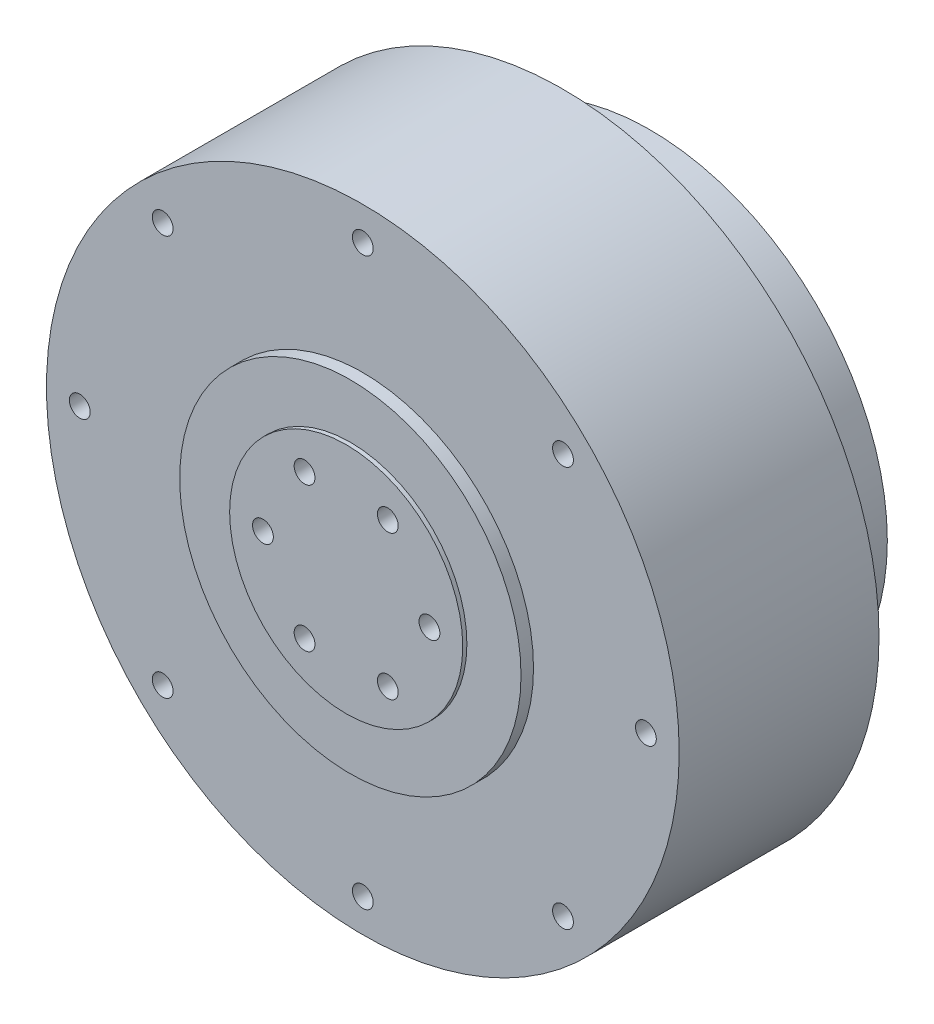
ISO-10303-21;
HEADER;
FILE_DESCRIPTION(('STEP AP214'),'2;1');
FILE_NAME('part.step','',(''),(''),'','','');
FILE_SCHEMA(('AUTOMOTIVE_DESIGN { 1 0 10303 214 1 1 1 1 }'));
ENDSEC;
DATA;
#1=APPLICATION_CONTEXT('core data for automotive mechanical design processes');
#2=APPLICATION_PROTOCOL_DEFINITION('international standard','automotive_design',2000,#1);
#3=PRODUCT_CONTEXT('',#1,'mechanical');
#4=PRODUCT('Part','Part','',(#3));
#5=PRODUCT_RELATED_PRODUCT_CATEGORY('part','',(#4));
#6=PRODUCT_DEFINITION_FORMATION('','',#4);
#7=PRODUCT_DEFINITION_CONTEXT('part definition',#1,'design');
#8=PRODUCT_DEFINITION('design','',#6,#7);
#9=PRODUCT_DEFINITION_SHAPE('','',#8);
#10=(LENGTH_UNIT() NAMED_UNIT(*) SI_UNIT(.MILLI.,.METRE.));
#11=(NAMED_UNIT(*) PLANE_ANGLE_UNIT() SI_UNIT($,.RADIAN.));
#12=(NAMED_UNIT(*) SI_UNIT($,.STERADIAN.) SOLID_ANGLE_UNIT());
#13=UNCERTAINTY_MEASURE_WITH_UNIT(LENGTH_MEASURE(1.E-05),#10,'distance_accuracy_value','');
#14=(GEOMETRIC_REPRESENTATION_CONTEXT(3) GLOBAL_UNCERTAINTY_ASSIGNED_CONTEXT((#13)) GLOBAL_UNIT_ASSIGNED_CONTEXT((#10,
#11,#12)) REPRESENTATION_CONTEXT('',''));
#15=CARTESIAN_POINT('',(0.,0.,0.));
#16=DIRECTION('',(0.,0.,1.));
#17=DIRECTION('',(1.,0.,0.));
#18=AXIS2_PLACEMENT_3D('',#15,#16,#17);
#19=CARTESIAN_POINT('',(0.,0.,0.));
#20=DIRECTION('',(0.,0.,-1.));
#21=DIRECTION('',(-1.,0.,0.));
#22=AXIS2_PLACEMENT_3D('',#19,#20,#21);
#23=PLANE('',#22);
#24=CARTESIAN_POINT('',(-10.,0.,0.));
#25=DIRECTION('',(0.,0.,1.));
#26=DIRECTION('',(1.,0.,0.));
#27=AXIS2_PLACEMENT_3D('',#24,#25,#26);
#28=CIRCLE('',#27,1.25);
#29=CARTESIAN_POINT('',(-8.75,0.,0.));
#30=VERTEX_POINT('',#29);
#31=EDGE_CURVE('E255',#30,#30,#28,.T.);
#32=ORIENTED_EDGE('',*,*,#31,.F.);
#33=EDGE_LOOP('',(#32));
#34=FACE_BOUND('',#33,.T.);
#35=CARTESIAN_POINT('',(-5.,8.6602540378444,0.));
#36=DIRECTION('',(0.,0.,1.));
#37=DIRECTION('',(1.,0.,0.));
#38=AXIS2_PLACEMENT_3D('',#35,#36,#37);
#39=CIRCLE('',#38,1.25);
#40=CARTESIAN_POINT('',(-3.75,8.6602540378444,0.));
#41=VERTEX_POINT('',#40);
#42=EDGE_CURVE('E263',#41,#41,#39,.T.);
#43=ORIENTED_EDGE('',*,*,#42,.F.);
#44=EDGE_LOOP('',(#43));
#45=FACE_BOUND('',#44,.T.);
#46=CARTESIAN_POINT('',(5.,8.66025403784441,0.));
#47=DIRECTION('',(0.,0.,1.));
#48=DIRECTION('',(1.,0.,0.));
#49=AXIS2_PLACEMENT_3D('',#46,#47,#48);
#50=CIRCLE('',#49,1.25);
#51=CARTESIAN_POINT('',(6.25,8.66025403784441,0.));
#52=VERTEX_POINT('',#51);
#53=EDGE_CURVE('E271',#52,#52,#50,.T.);
#54=ORIENTED_EDGE('',*,*,#53,.F.);
#55=EDGE_LOOP('',(#54));
#56=FACE_BOUND('',#55,.T.);
#57=CARTESIAN_POINT('',(10.,0.,0.));
#58=DIRECTION('',(0.,0.,1.));
#59=DIRECTION('',(1.,0.,0.));
#60=AXIS2_PLACEMENT_3D('',#57,#58,#59);
#61=CIRCLE('',#60,1.25);
#62=CARTESIAN_POINT('',(11.25,0.,0.));
#63=VERTEX_POINT('',#62);
#64=EDGE_CURVE('E279',#63,#63,#61,.T.);
#65=ORIENTED_EDGE('',*,*,#64,.F.);
#66=EDGE_LOOP('',(#65));
#67=FACE_BOUND('',#66,.T.);
#68=CARTESIAN_POINT('',(5.,-8.66025403784437,0.));
#69=DIRECTION('',(0.,0.,1.));
#70=DIRECTION('',(1.,0.,0.));
#71=AXIS2_PLACEMENT_3D('',#68,#69,#70);
#72=CIRCLE('',#71,1.25);
#73=CARTESIAN_POINT('',(6.25,-8.66025403784437,0.));
#74=VERTEX_POINT('',#73);
#75=EDGE_CURVE('E287',#74,#74,#72,.T.);
#76=ORIENTED_EDGE('',*,*,#75,.F.);
#77=EDGE_LOOP('',(#76));
#78=FACE_BOUND('',#77,.T.);
#79=CARTESIAN_POINT('',(-5.,-8.66025403784437,0.));
#80=DIRECTION('',(0.,0.,1.));
#81=DIRECTION('',(1.,0.,0.));
#82=AXIS2_PLACEMENT_3D('',#79,#80,#81);
#83=CIRCLE('',#82,1.25);
#84=CARTESIAN_POINT('',(-3.75,-8.66025403784437,0.));
#85=VERTEX_POINT('',#84);
#86=EDGE_CURVE('E295',#85,#85,#83,.T.);
#87=ORIENTED_EDGE('',*,*,#86,.F.);
#88=EDGE_LOOP('',(#87));
#89=FACE_BOUND('',#88,.T.);
#90=CARTESIAN_POINT('',(0.,0.,0.));
#91=DIRECTION('',(0.,0.,1.));
#92=DIRECTION('',(1.,0.,0.));
#93=AXIS2_PLACEMENT_3D('',#90,#91,#92);
#94=CIRCLE('',#93,14.);
#95=CARTESIAN_POINT('',(14.,0.,0.));
#96=VERTEX_POINT('',#95);
#97=EDGE_CURVE('E11',#96,#96,#94,.T.);
#98=ORIENTED_EDGE('',*,*,#97,.T.);
#99=EDGE_LOOP('',(#98));
#100=FACE_BOUND('',#99,.T.);
#101=ADVANCED_FACE('F43',(#34,#45,#56,#67,#78,#89,#100),#23,.F.);
#102=CARTESIAN_POINT('',(0.,0.,42.7707487283704));
#103=DIRECTION('',(0.,0.,1.));
#104=DIRECTION('',(1.,0.,0.));
#105=AXIS2_PLACEMENT_3D('',#102,#103,#104);
#106=CYLINDRICAL_SURFACE('',#105,14.);
#107=ORIENTED_EDGE('',*,*,#97,.F.);
#108=EDGE_LOOP('',(#107));
#109=FACE_BOUND('',#108,.T.);
#110=CARTESIAN_POINT('',(0.,0.,-0.5));
#111=DIRECTION('',(0.,0.,1.));
#112=DIRECTION('',(1.,0.,0.));
#113=AXIS2_PLACEMENT_3D('',#110,#111,#112);
#114=CIRCLE('',#113,14.);
#115=CARTESIAN_POINT('',(14.,0.,-0.5));
#116=VERTEX_POINT('',#115);
#117=EDGE_CURVE('E51',#116,#116,#114,.T.);
#118=ORIENTED_EDGE('',*,*,#117,.T.);
#119=EDGE_LOOP('',(#118));
#120=FACE_BOUND('',#119,.T.);
#121=ADVANCED_FACE('F330',(#109,#120),#106,.T.);
#122=CARTESIAN_POINT('',(0.,14.,-0.5));
#123=DIRECTION('',(0.,0.,-1.));
#124=DIRECTION('',(-1.,0.,0.));
#125=AXIS2_PLACEMENT_3D('',#122,#123,#124);
#126=PLANE('',#125);
#127=ORIENTED_EDGE('',*,*,#117,.F.);
#128=EDGE_LOOP('',(#127));
#129=FACE_BOUND('',#128,.T.);
#130=CARTESIAN_POINT('',(0.,0.,-0.5));
#131=DIRECTION('',(0.,0.,1.));
#132=DIRECTION('',(1.,0.,0.));
#133=AXIS2_PLACEMENT_3D('',#130,#131,#132);
#134=CIRCLE('',#133,20.5);
#135=CARTESIAN_POINT('',(20.5,0.,-0.5));
#136=VERTEX_POINT('',#135);
#137=EDGE_CURVE('E323',#136,#136,#134,.T.);
#138=ORIENTED_EDGE('',*,*,#137,.T.);
#139=EDGE_LOOP('',(#138));
#140=FACE_BOUND('',#139,.T.);
#141=ADVANCED_FACE('F332',(#129,#140),#126,.F.);
#142=CARTESIAN_POINT('',(0.,0.,42.7707487283704));
#143=DIRECTION('',(0.,0.,1.));
#144=DIRECTION('',(1.,0.,0.));
#145=AXIS2_PLACEMENT_3D('',#142,#143,#144);
#146=CYLINDRICAL_SURFACE('',#145,20.5);
#147=ORIENTED_EDGE('',*,*,#137,.F.);
#148=EDGE_LOOP('',(#147));
#149=FACE_BOUND('',#148,.T.);
#150=CARTESIAN_POINT('',(0.,0.,-2.));
#151=DIRECTION('',(0.,0.,1.));
#152=DIRECTION('',(1.,0.,0.));
#153=AXIS2_PLACEMENT_3D('',#150,#151,#152);
#154=CIRCLE('',#153,20.5);
#155=CARTESIAN_POINT('',(20.5,0.,-2.));
#156=VERTEX_POINT('',#155);
#157=EDGE_CURVE('E319',#156,#156,#154,.T.);
#158=ORIENTED_EDGE('',*,*,#157,.T.);
#159=EDGE_LOOP('',(#158));
#160=FACE_BOUND('',#159,.T.);
#161=ADVANCED_FACE('F335',(#149,#160),#146,.T.);
#162=CARTESIAN_POINT('',(0.,20.5,-2.));
#163=DIRECTION('',(0.,0.,-1.));
#164=DIRECTION('',(-1.,0.,0.));
#165=AXIS2_PLACEMENT_3D('',#162,#163,#164);
#166=PLANE('',#165);
#167=CARTESIAN_POINT('',(-34.,0.,-2.));
#168=DIRECTION('',(0.,0.,1.));
#169=DIRECTION('',(1.,0.,0.));
#170=AXIS2_PLACEMENT_3D('',#167,#168,#169);
#171=CIRCLE('',#170,1.25);
#172=CARTESIAN_POINT('',(-32.75,0.,-2.));
#173=VERTEX_POINT('',#172);
#174=EDGE_CURVE('E191',#173,#173,#171,.T.);
#175=ORIENTED_EDGE('',*,*,#174,.F.);
#176=EDGE_LOOP('',(#175));
#177=FACE_BOUND('',#176,.T.);
#178=CARTESIAN_POINT('',(-24.0416305603426,24.0416305603426,-2.));
#179=DIRECTION('',(0.,0.,1.));
#180=DIRECTION('',(1.,0.,0.));
#181=AXIS2_PLACEMENT_3D('',#178,#179,#180);
#182=CIRCLE('',#181,1.25);
#183=CARTESIAN_POINT('',(-22.7916305603426,24.0416305603426,-2.));
#184=VERTEX_POINT('',#183);
#185=EDGE_CURVE('E199',#184,#184,#182,.T.);
#186=ORIENTED_EDGE('',*,*,#185,.F.);
#187=EDGE_LOOP('',(#186));
#188=FACE_BOUND('',#187,.T.);
#189=CARTESIAN_POINT('',(0.,33.9999999999999,-2.));
#190=DIRECTION('',(0.,0.,1.));
#191=DIRECTION('',(1.,0.,0.));
#192=AXIS2_PLACEMENT_3D('',#189,#190,#191);
#193=CIRCLE('',#192,1.25);
#194=CARTESIAN_POINT('',(1.25000000000007,33.9999999999999,-2.));
#195=VERTEX_POINT('',#194);
#196=EDGE_CURVE('E207',#195,#195,#193,.T.);
#197=ORIENTED_EDGE('',*,*,#196,.F.);
#198=EDGE_LOOP('',(#197));
#199=FACE_BOUND('',#198,.T.);
#200=CARTESIAN_POINT('',(24.0416305603427,24.0416305603425,-2.));
#201=DIRECTION('',(0.,0.,1.));
#202=DIRECTION('',(1.,0.,0.));
#203=AXIS2_PLACEMENT_3D('',#200,#201,#202);
#204=CIRCLE('',#203,1.25);
#205=CARTESIAN_POINT('',(25.2916305603427,24.0416305603425,-2.));
#206=VERTEX_POINT('',#205);
#207=EDGE_CURVE('E215',#206,#206,#204,.T.);
#208=ORIENTED_EDGE('',*,*,#207,.F.);
#209=EDGE_LOOP('',(#208));
#210=FACE_BOUND('',#209,.T.);
#211=CARTESIAN_POINT('',(34.,-1.50053580671994E-13,-2.));
#212=DIRECTION('',(0.,0.,1.));
#213=DIRECTION('',(1.,0.,0.));
#214=AXIS2_PLACEMENT_3D('',#211,#212,#213);
#215=CIRCLE('',#214,1.25);
#216=CARTESIAN_POINT('',(35.25,-1.50053580671994E-13,-2.));
#217=VERTEX_POINT('',#216);
#218=EDGE_CURVE('E223',#217,#217,#215,.T.);
#219=ORIENTED_EDGE('',*,*,#218,.F.);
#220=EDGE_LOOP('',(#219));
#221=FACE_BOUND('',#220,.T.);
#222=CARTESIAN_POINT('',(24.0416305603426,-24.0416305603427,-2.));
#223=DIRECTION('',(0.,0.,1.));
#224=DIRECTION('',(1.,0.,0.));
#225=AXIS2_PLACEMENT_3D('',#222,#223,#224);
#226=CIRCLE('',#225,1.25);
#227=CARTESIAN_POINT('',(25.2916305603426,-24.0416305603427,-2.));
#228=VERTEX_POINT('',#227);
#229=EDGE_CURVE('E231',#228,#228,#226,.T.);
#230=ORIENTED_EDGE('',*,*,#229,.F.);
#231=EDGE_LOOP('',(#230));
#232=FACE_BOUND('',#231,.T.);
#233=CARTESIAN_POINT('',(0.,-34.0000000000001,-2.));
#234=DIRECTION('',(0.,0.,1.));
#235=DIRECTION('',(1.,0.,0.));
#236=AXIS2_PLACEMENT_3D('',#233,#234,#235);
#237=CIRCLE('',#236,1.25);
#238=CARTESIAN_POINT('',(1.24999999999993,-34.0000000000001,-2.));
#239=VERTEX_POINT('',#238);
#240=EDGE_CURVE('E239',#239,#239,#237,.T.);
#241=ORIENTED_EDGE('',*,*,#240,.F.);
#242=EDGE_LOOP('',(#241));
#243=FACE_BOUND('',#242,.T.);
#244=CARTESIAN_POINT('',(-24.0416305603427,-24.0416305603426,-2.));
#245=DIRECTION('',(0.,0.,1.));
#246=DIRECTION('',(1.,0.,0.));
#247=AXIS2_PLACEMENT_3D('',#244,#245,#246);
#248=CIRCLE('',#247,1.25);
#249=CARTESIAN_POINT('',(-22.7916305603427,-24.0416305603426,-2.));
#250=VERTEX_POINT('',#249);
#251=EDGE_CURVE('E247',#250,#250,#248,.T.);
#252=ORIENTED_EDGE('',*,*,#251,.F.);
#253=EDGE_LOOP('',(#252));
#254=FACE_BOUND('',#253,.T.);
#255=ORIENTED_EDGE('',*,*,#157,.F.);
#256=EDGE_LOOP('',(#255));
#257=FACE_BOUND('',#256,.T.);
#258=CARTESIAN_POINT('',(0.,0.,-2.));
#259=DIRECTION('',(0.,0.,1.));
#260=DIRECTION('',(1.,0.,0.));
#261=AXIS2_PLACEMENT_3D('',#258,#259,#260);
#262=CIRCLE('',#261,38.);
#263=CARTESIAN_POINT('',(38.,0.,-2.));
#264=VERTEX_POINT('',#263);
#265=EDGE_CURVE('E315',#264,#264,#262,.T.);
#266=ORIENTED_EDGE('',*,*,#265,.T.);
#267=EDGE_LOOP('',(#266));
#268=FACE_BOUND('',#267,.T.);
#269=ADVANCED_FACE('F341',(#177,#188,#199,#210,#221,#232,#243,#254,#257,#268),#166,.F.);
#270=CARTESIAN_POINT('',(0.,0.,42.7707487283704));
#271=DIRECTION('',(0.,0.,1.));
#272=DIRECTION('',(1.,0.,0.));
#273=AXIS2_PLACEMENT_3D('',#270,#271,#272);
#274=CYLINDRICAL_SURFACE('',#273,38.);
#275=ORIENTED_EDGE('',*,*,#265,.F.);
#276=EDGE_LOOP('',(#275));
#277=FACE_BOUND('',#276,.T.);
#278=CARTESIAN_POINT('',(0.,0.,-26.));
#279=DIRECTION('',(0.,0.,1.));
#280=DIRECTION('',(1.,0.,0.));
#281=AXIS2_PLACEMENT_3D('',#278,#279,#280);
#282=CIRCLE('',#281,38.);
#283=CARTESIAN_POINT('',(38.,0.,-26.));
#284=VERTEX_POINT('',#283);
#285=EDGE_CURVE('E311',#284,#284,#282,.T.);
#286=ORIENTED_EDGE('',*,*,#285,.T.);
#287=EDGE_LOOP('',(#286));
#288=FACE_BOUND('',#287,.T.);
#289=ADVANCED_FACE('F347',(#277,#288),#274,.T.);
#290=CARTESIAN_POINT('',(0.,38.,-26.));
#291=DIRECTION('',(0.,0.,1.));
#292=DIRECTION('',(1.,0.,0.));
#293=AXIS2_PLACEMENT_3D('',#290,#291,#292);
#294=PLANE('',#293);
#295=CARTESIAN_POINT('',(34.,0.,-26.));
#296=DIRECTION('',(0.,0.,-1.));
#297=DIRECTION('',(-1.,0.,0.));
#298=AXIS2_PLACEMENT_3D('',#295,#296,#297);
#299=CIRCLE('',#298,1.24999999999999);
#300=CARTESIAN_POINT('',(32.75,0.,-26.));
#301=VERTEX_POINT('',#300);
#302=EDGE_CURVE('E130',#301,#301,#299,.T.);
#303=ORIENTED_EDGE('',*,*,#302,.F.);
#304=EDGE_LOOP('',(#303));
#305=FACE_BOUND('',#304,.T.);
#306=CARTESIAN_POINT('',(24.0416305603426,24.0416305603426,-26.));
#307=DIRECTION('',(0.,0.,-1.));
#308=DIRECTION('',(-1.,0.,0.));
#309=AXIS2_PLACEMENT_3D('',#306,#307,#308);
#310=CIRCLE('',#309,1.24999999999999);
#311=CARTESIAN_POINT('',(22.7916305603426,24.0416305603426,-26.));
#312=VERTEX_POINT('',#311);
#313=EDGE_CURVE('E129',#312,#312,#310,.T.);
#314=ORIENTED_EDGE('',*,*,#313,.F.);
#315=EDGE_LOOP('',(#314));
#316=FACE_BOUND('',#315,.T.);
#317=CARTESIAN_POINT('',(0.,33.9999999999999,-26.));
#318=DIRECTION('',(0.,0.,-1.));
#319=DIRECTION('',(-1.,0.,0.));
#320=AXIS2_PLACEMENT_3D('',#317,#318,#319);
#321=CIRCLE('',#320,1.24999999999999);
#322=CARTESIAN_POINT('',(-1.25000000000006,33.9999999999999,-26.));
#323=VERTEX_POINT('',#322);
#324=EDGE_CURVE('E143',#323,#323,#321,.T.);
#325=ORIENTED_EDGE('',*,*,#324,.F.);
#326=EDGE_LOOP('',(#325));
#327=FACE_BOUND('',#326,.T.);
#328=CARTESIAN_POINT('',(-24.0416305603427,24.0416305603425,-26.));
#329=DIRECTION('',(0.,0.,-1.));
#330=DIRECTION('',(-1.,0.,0.));
#331=AXIS2_PLACEMENT_3D('',#328,#329,#330);
#332=CIRCLE('',#331,1.24999999999999);
#333=CARTESIAN_POINT('',(-25.2916305603427,24.0416305603425,-26.));
#334=VERTEX_POINT('',#333);
#335=EDGE_CURVE('E151',#334,#334,#332,.T.);
#336=ORIENTED_EDGE('',*,*,#335,.F.);
#337=EDGE_LOOP('',(#336));
#338=FACE_BOUND('',#337,.T.);
#339=CARTESIAN_POINT('',(-34.,-1.50053580671994E-13,-26.));
#340=DIRECTION('',(0.,0.,-1.));
#341=DIRECTION('',(-1.,0.,0.));
#342=AXIS2_PLACEMENT_3D('',#339,#340,#341);
#343=CIRCLE('',#342,1.24999999999999);
#344=CARTESIAN_POINT('',(-35.25,-1.50053580671994E-13,-26.));
#345=VERTEX_POINT('',#344);
#346=EDGE_CURVE('E159',#345,#345,#343,.T.);
#347=ORIENTED_EDGE('',*,*,#346,.F.);
#348=EDGE_LOOP('',(#347));
#349=FACE_BOUND('',#348,.T.);
#350=CARTESIAN_POINT('',(-24.0416305603426,-24.0416305603427,-26.));
#351=DIRECTION('',(0.,0.,-1.));
#352=DIRECTION('',(-1.,0.,0.));
#353=AXIS2_PLACEMENT_3D('',#350,#351,#352);
#354=CIRCLE('',#353,1.24999999999999);
#355=CARTESIAN_POINT('',(-25.2916305603426,-24.0416305603427,-26.));
#356=VERTEX_POINT('',#355);
#357=EDGE_CURVE('E167',#356,#356,#354,.T.);
#358=ORIENTED_EDGE('',*,*,#357,.F.);
#359=EDGE_LOOP('',(#358));
#360=FACE_BOUND('',#359,.T.);
#361=CARTESIAN_POINT('',(0.,-34.0000000000001,-26.));
#362=DIRECTION('',(0.,0.,-1.));
#363=DIRECTION('',(-1.,0.,0.));
#364=AXIS2_PLACEMENT_3D('',#361,#362,#363);
#365=CIRCLE('',#364,1.24999999999999);
#366=CARTESIAN_POINT('',(-1.24999999999992,-34.0000000000001,-26.));
#367=VERTEX_POINT('',#366);
#368=EDGE_CURVE('E175',#367,#367,#365,.T.);
#369=ORIENTED_EDGE('',*,*,#368,.F.);
#370=EDGE_LOOP('',(#369));
#371=FACE_BOUND('',#370,.T.);
#372=CARTESIAN_POINT('',(24.0416305603427,-24.0416305603426,-26.));
#373=DIRECTION('',(0.,0.,-1.));
#374=DIRECTION('',(-1.,0.,0.));
#375=AXIS2_PLACEMENT_3D('',#372,#373,#374);
#376=CIRCLE('',#375,1.24999999999999);
#377=CARTESIAN_POINT('',(22.7916305603427,-24.0416305603426,-26.));
#378=VERTEX_POINT('',#377);
#379=EDGE_CURVE('E183',#378,#378,#376,.T.);
#380=ORIENTED_EDGE('',*,*,#379,.F.);
#381=EDGE_LOOP('',(#380));
#382=FACE_BOUND('',#381,.T.);
#383=ORIENTED_EDGE('',*,*,#285,.F.);
#384=EDGE_LOOP('',(#383));
#385=FACE_BOUND('',#384,.T.);
#386=CARTESIAN_POINT('',(0.,0.,-26.));
#387=DIRECTION('',(0.,0.,1.));
#388=DIRECTION('',(1.,0.,0.));
#389=AXIS2_PLACEMENT_3D('',#386,#387,#388);
#390=CIRCLE('',#389,28.5);
#391=CARTESIAN_POINT('',(28.5,0.,-26.));
#392=VERTEX_POINT('',#391);
#393=EDGE_CURVE('E307',#392,#392,#390,.T.);
#394=ORIENTED_EDGE('',*,*,#393,.T.);
#395=EDGE_LOOP('',(#394));
#396=FACE_BOUND('',#395,.T.);
#397=ADVANCED_FACE('F354',(#305,#316,#327,#338,#349,#360,#371,#382,#385,#396),#294,.F.);
#398=CARTESIAN_POINT('',(0.,0.,42.7707487283704));
#399=DIRECTION('',(0.,0.,1.));
#400=DIRECTION('',(1.,0.,0.));
#401=AXIS2_PLACEMENT_3D('',#398,#399,#400);
#402=CYLINDRICAL_SURFACE('',#401,28.5);
#403=ORIENTED_EDGE('',*,*,#393,.F.);
#404=EDGE_LOOP('',(#403));
#405=FACE_BOUND('',#404,.T.);
#406=CARTESIAN_POINT('',(0.,0.,-36.5));
#407=DIRECTION('',(0.,0.,1.));
#408=DIRECTION('',(1.,0.,0.));
#409=AXIS2_PLACEMENT_3D('',#406,#407,#408);
#410=CIRCLE('',#409,28.5);
#411=CARTESIAN_POINT('',(28.5,0.,-36.5));
#412=VERTEX_POINT('',#411);
#413=EDGE_CURVE('E303',#412,#412,#410,.T.);
#414=ORIENTED_EDGE('',*,*,#413,.T.);
#415=EDGE_LOOP('',(#414));
#416=FACE_BOUND('',#415,.T.);
#417=ADVANCED_FACE('F360',(#405,#416),#402,.T.);
#418=CARTESIAN_POINT('',(0.,28.5,-36.5));
#419=DIRECTION('',(0.,0.,1.));
#420=DIRECTION('',(1.,0.,0.));
#421=AXIS2_PLACEMENT_3D('',#418,#419,#420);
#422=PLANE('',#421);
#423=ORIENTED_EDGE('',*,*,#413,.F.);
#424=EDGE_LOOP('',(#423));
#425=FACE_BOUND('',#424,.T.);
#426=ADVANCED_FACE('F367',(#425),#422,.F.);
#427=CARTESIAN_POINT('',(-5.,-8.66025403784437,-7.5));
#428=DIRECTION('',(0.,0.,1.));
#429=DIRECTION('',(1.,0.,0.));
#430=AXIS2_PLACEMENT_3D('',#427,#428,#429);
#431=CONICAL_SURFACE('',#430,1.25,1.02974425867665);
#432=CARTESIAN_POINT('',(-5.,-8.66025403784437,-8.25107577378445));
#433=VERTEX_POINT('',#432);
#434=VERTEX_LOOP('',#433);
#435=FACE_BOUND('',#434,.T.);
#436=CARTESIAN_POINT('',(-5.,-8.66025403784437,-7.5));
#437=DIRECTION('',(0.,0.,1.));
#438=DIRECTION('',(1.,0.,0.));
#439=AXIS2_PLACEMENT_3D('',#436,#437,#438);
#440=CIRCLE('',#439,1.25);
#441=CARTESIAN_POINT('',(-3.75,-8.66025403784437,-7.5));
#442=VERTEX_POINT('',#441);
#443=EDGE_CURVE('E299',#442,#442,#440,.T.);
#444=ORIENTED_EDGE('',*,*,#443,.T.);
#445=EDGE_LOOP('',(#444));
#446=FACE_BOUND('',#445,.T.);
#447=ADVANCED_FACE('F372',(#435,#446),#431,.F.);
#448=CARTESIAN_POINT('',(-5.,-8.66025403784437,0.));
#449=DIRECTION('',(0.,0.,1.));
#450=DIRECTION('',(1.,0.,0.));
#451=AXIS2_PLACEMENT_3D('',#448,#449,#450);
#452=CYLINDRICAL_SURFACE('',#451,1.25);
#453=ORIENTED_EDGE('',*,*,#443,.F.);
#454=EDGE_LOOP('',(#453));
#455=FACE_BOUND('',#454,.T.);
#456=ORIENTED_EDGE('',*,*,#86,.T.);
#457=EDGE_LOOP('',(#456));
#458=FACE_BOUND('',#457,.T.);
#459=ADVANCED_FACE('F377',(#455,#458),#452,.F.);
#460=CARTESIAN_POINT('',(5.,-8.66025403784437,-7.5));
#461=DIRECTION('',(0.,0.,1.));
#462=DIRECTION('',(1.,0.,0.));
#463=AXIS2_PLACEMENT_3D('',#460,#461,#462);
#464=CONICAL_SURFACE('',#463,1.25,1.02974425867665);
#465=CARTESIAN_POINT('',(5.,-8.66025403784437,-8.25107577378445));
#466=VERTEX_POINT('',#465);
#467=VERTEX_LOOP('',#466);
#468=FACE_BOUND('',#467,.T.);
#469=CARTESIAN_POINT('',(5.,-8.66025403784437,-7.5));
#470=DIRECTION('',(0.,0.,1.));
#471=DIRECTION('',(1.,0.,0.));
#472=AXIS2_PLACEMENT_3D('',#469,#470,#471);
#473=CIRCLE('',#472,1.25);
#474=CARTESIAN_POINT('',(6.25,-8.66025403784437,-7.5));
#475=VERTEX_POINT('',#474);
#476=EDGE_CURVE('E291',#475,#475,#473,.T.);
#477=ORIENTED_EDGE('',*,*,#476,.T.);
#478=EDGE_LOOP('',(#477));
#479=FACE_BOUND('',#478,.T.);
#480=ADVANCED_FACE('F400',(#468,#479),#464,.F.);
#481=CARTESIAN_POINT('',(5.,-8.66025403784437,0.));
#482=DIRECTION('',(0.,0.,1.));
#483=DIRECTION('',(1.,0.,0.));
#484=AXIS2_PLACEMENT_3D('',#481,#482,#483);
#485=CYLINDRICAL_SURFACE('',#484,1.25);
#486=ORIENTED_EDGE('',*,*,#476,.F.);
#487=EDGE_LOOP('',(#486));
#488=FACE_BOUND('',#487,.T.);
#489=ORIENTED_EDGE('',*,*,#75,.T.);
#490=EDGE_LOOP('',(#489));
#491=FACE_BOUND('',#490,.T.);
#492=ADVANCED_FACE('F406',(#488,#491),#485,.F.);
#493=CARTESIAN_POINT('',(10.,0.,-7.5));
#494=DIRECTION('',(0.,0.,1.));
#495=DIRECTION('',(1.,0.,0.));
#496=AXIS2_PLACEMENT_3D('',#493,#494,#495);
#497=CONICAL_SURFACE('',#496,1.25,1.02974425867665);
#498=CARTESIAN_POINT('',(10.,0.,-8.25107577378445));
#499=VERTEX_POINT('',#498);
#500=VERTEX_LOOP('',#499);
#501=FACE_BOUND('',#500,.T.);
#502=CARTESIAN_POINT('',(10.,0.,-7.5));
#503=DIRECTION('',(0.,0.,1.));
#504=DIRECTION('',(1.,0.,0.));
#505=AXIS2_PLACEMENT_3D('',#502,#503,#504);
#506=CIRCLE('',#505,1.25);
#507=CARTESIAN_POINT('',(11.25,0.,-7.5));
#508=VERTEX_POINT('',#507);
#509=EDGE_CURVE('E283',#508,#508,#506,.T.);
#510=ORIENTED_EDGE('',*,*,#509,.T.);
#511=EDGE_LOOP('',(#510));
#512=FACE_BOUND('',#511,.T.);
#513=ADVANCED_FACE('F412',(#501,#512),#497,.F.);
#514=CARTESIAN_POINT('',(10.,0.,0.));
#515=DIRECTION('',(0.,0.,1.));
#516=DIRECTION('',(1.,0.,0.));
#517=AXIS2_PLACEMENT_3D('',#514,#515,#516);
#518=CYLINDRICAL_SURFACE('',#517,1.25);
#519=ORIENTED_EDGE('',*,*,#509,.F.);
#520=EDGE_LOOP('',(#519));
#521=FACE_BOUND('',#520,.T.);
#522=ORIENTED_EDGE('',*,*,#64,.T.);
#523=EDGE_LOOP('',(#522));
#524=FACE_BOUND('',#523,.T.);
#525=ADVANCED_FACE('F416',(#521,#524),#518,.F.);
#526=CARTESIAN_POINT('',(5.,8.66025403784441,-7.5));
#527=DIRECTION('',(0.,0.,1.));
#528=DIRECTION('',(1.,0.,0.));
#529=AXIS2_PLACEMENT_3D('',#526,#527,#528);
#530=CONICAL_SURFACE('',#529,1.25,1.02974425867665);
#531=CARTESIAN_POINT('',(5.,8.66025403784441,-8.25107577378445));
#532=VERTEX_POINT('',#531);
#533=VERTEX_LOOP('',#532);
#534=FACE_BOUND('',#533,.T.);
#535=CARTESIAN_POINT('',(5.,8.66025403784441,-7.5));
#536=DIRECTION('',(0.,0.,1.));
#537=DIRECTION('',(1.,0.,0.));
#538=AXIS2_PLACEMENT_3D('',#535,#536,#537);
#539=CIRCLE('',#538,1.25);
#540=CARTESIAN_POINT('',(6.25,8.66025403784441,-7.5));
#541=VERTEX_POINT('',#540);
#542=EDGE_CURVE('E275',#541,#541,#539,.T.);
#543=ORIENTED_EDGE('',*,*,#542,.T.);
#544=EDGE_LOOP('',(#543));
#545=FACE_BOUND('',#544,.T.);
#546=ADVANCED_FACE('F420',(#534,#545),#530,.F.);
#547=CARTESIAN_POINT('',(5.,8.66025403784441,0.));
#548=DIRECTION('',(0.,0.,1.));
#549=DIRECTION('',(1.,0.,0.));
#550=AXIS2_PLACEMENT_3D('',#547,#548,#549);
#551=CYLINDRICAL_SURFACE('',#550,1.25);
#552=ORIENTED_EDGE('',*,*,#542,.F.);
#553=EDGE_LOOP('',(#552));
#554=FACE_BOUND('',#553,.T.);
#555=ORIENTED_EDGE('',*,*,#53,.T.);
#556=EDGE_LOOP('',(#555));
#557=FACE_BOUND('',#556,.T.);
#558=ADVANCED_FACE('F424',(#554,#557),#551,.F.);
#559=CARTESIAN_POINT('',(-5.,8.6602540378444,-7.5));
#560=DIRECTION('',(0.,0.,1.));
#561=DIRECTION('',(1.,0.,0.));
#562=AXIS2_PLACEMENT_3D('',#559,#560,#561);
#563=CONICAL_SURFACE('',#562,1.25,1.02974425867665);
#564=CARTESIAN_POINT('',(-5.,8.6602540378444,-8.25107577378445));
#565=VERTEX_POINT('',#564);
#566=VERTEX_LOOP('',#565);
#567=FACE_BOUND('',#566,.T.);
#568=CARTESIAN_POINT('',(-5.,8.6602540378444,-7.5));
#569=DIRECTION('',(0.,0.,1.));
#570=DIRECTION('',(1.,0.,0.));
#571=AXIS2_PLACEMENT_3D('',#568,#569,#570);
#572=CIRCLE('',#571,1.25);
#573=CARTESIAN_POINT('',(-3.75,8.6602540378444,-7.5));
#574=VERTEX_POINT('',#573);
#575=EDGE_CURVE('E267',#574,#574,#572,.T.);
#576=ORIENTED_EDGE('',*,*,#575,.T.);
#577=EDGE_LOOP('',(#576));
#578=FACE_BOUND('',#577,.T.);
#579=ADVANCED_FACE('F428',(#567,#578),#563,.F.);
#580=CARTESIAN_POINT('',(-5.,8.6602540378444,0.));
#581=DIRECTION('',(0.,0.,1.));
#582=DIRECTION('',(1.,0.,0.));
#583=AXIS2_PLACEMENT_3D('',#580,#581,#582);
#584=CYLINDRICAL_SURFACE('',#583,1.25);
#585=ORIENTED_EDGE('',*,*,#575,.F.);
#586=EDGE_LOOP('',(#585));
#587=FACE_BOUND('',#586,.T.);
#588=ORIENTED_EDGE('',*,*,#42,.T.);
#589=EDGE_LOOP('',(#588));
#590=FACE_BOUND('',#589,.T.);
#591=ADVANCED_FACE('F432',(#587,#590),#584,.F.);
#592=CARTESIAN_POINT('',(-10.,0.,-7.5));
#593=DIRECTION('',(0.,0.,1.));
#594=DIRECTION('',(1.,0.,0.));
#595=AXIS2_PLACEMENT_3D('',#592,#593,#594);
#596=CONICAL_SURFACE('',#595,1.25,1.02974425867665);
#597=CARTESIAN_POINT('',(-10.,0.,-8.25107577378445));
#598=VERTEX_POINT('',#597);
#599=VERTEX_LOOP('',#598);
#600=FACE_BOUND('',#599,.T.);
#601=CARTESIAN_POINT('',(-10.,0.,-7.5));
#602=DIRECTION('',(0.,0.,1.));
#603=DIRECTION('',(1.,0.,0.));
#604=AXIS2_PLACEMENT_3D('',#601,#602,#603);
#605=CIRCLE('',#604,1.25);
#606=CARTESIAN_POINT('',(-8.75,0.,-7.5));
#607=VERTEX_POINT('',#606);
#608=EDGE_CURVE('E259',#607,#607,#605,.T.);
#609=ORIENTED_EDGE('',*,*,#608,.T.);
#610=EDGE_LOOP('',(#609));
#611=FACE_BOUND('',#610,.T.);
#612=ADVANCED_FACE('F436',(#600,#611),#596,.F.);
#613=CARTESIAN_POINT('',(-10.,0.,0.));
#614=DIRECTION('',(0.,0.,1.));
#615=DIRECTION('',(1.,0.,0.));
#616=AXIS2_PLACEMENT_3D('',#613,#614,#615);
#617=CYLINDRICAL_SURFACE('',#616,1.25);
#618=ORIENTED_EDGE('',*,*,#608,.F.);
#619=EDGE_LOOP('',(#618));
#620=FACE_BOUND('',#619,.T.);
#621=ORIENTED_EDGE('',*,*,#31,.T.);
#622=EDGE_LOOP('',(#621));
#623=FACE_BOUND('',#622,.T.);
#624=ADVANCED_FACE('F440',(#620,#623),#617,.F.);
#625=CARTESIAN_POINT('',(-24.0416305603427,-24.0416305603426,-5.));
#626=DIRECTION('',(0.,0.,1.));
#627=DIRECTION('',(1.,0.,0.));
#628=AXIS2_PLACEMENT_3D('',#625,#626,#627);
#629=CONICAL_SURFACE('',#628,1.25,1.02974425867665);
#630=CARTESIAN_POINT('',(-24.0416305603427,-24.0416305603426,-5.75107577378445));
#631=VERTEX_POINT('',#630);
#632=VERTEX_LOOP('',#631);
#633=FACE_BOUND('',#632,.T.);
#634=CARTESIAN_POINT('',(-24.0416305603427,-24.0416305603426,-5.));
#635=DIRECTION('',(0.,0.,1.));
#636=DIRECTION('',(1.,0.,0.));
#637=AXIS2_PLACEMENT_3D('',#634,#635,#636);
#638=CIRCLE('',#637,1.25);
#639=CARTESIAN_POINT('',(-22.7916305603427,-24.0416305603426,-5.));
#640=VERTEX_POINT('',#639);
#641=EDGE_CURVE('E251',#640,#640,#638,.T.);
#642=ORIENTED_EDGE('',*,*,#641,.T.);
#643=EDGE_LOOP('',(#642));
#644=FACE_BOUND('',#643,.T.);
#645=ADVANCED_FACE('F444',(#633,#644),#629,.F.);
#646=CARTESIAN_POINT('',(-24.0416305603427,-24.0416305603426,-2.));
#647=DIRECTION('',(0.,0.,1.));
#648=DIRECTION('',(1.,0.,0.));
#649=AXIS2_PLACEMENT_3D('',#646,#647,#648);
#650=CYLINDRICAL_SURFACE('',#649,1.25);
#651=ORIENTED_EDGE('',*,*,#641,.F.);
#652=EDGE_LOOP('',(#651));
#653=FACE_BOUND('',#652,.T.);
#654=ORIENTED_EDGE('',*,*,#251,.T.);
#655=EDGE_LOOP('',(#654));
#656=FACE_BOUND('',#655,.T.);
#657=ADVANCED_FACE('F448',(#653,#656),#650,.F.);
#658=CARTESIAN_POINT('',(0.,-34.0000000000001,-5.));
#659=DIRECTION('',(0.,0.,1.));
#660=DIRECTION('',(1.,0.,0.));
#661=AXIS2_PLACEMENT_3D('',#658,#659,#660);
#662=CONICAL_SURFACE('',#661,1.25,1.02974425867665);
#663=CARTESIAN_POINT('',(0.,-34.0000000000001,-5.75107577378445));
#664=VERTEX_POINT('',#663);
#665=VERTEX_LOOP('',#664);
#666=FACE_BOUND('',#665,.T.);
#667=CARTESIAN_POINT('',(0.,-34.0000000000001,-5.));
#668=DIRECTION('',(0.,0.,1.));
#669=DIRECTION('',(1.,0.,0.));
#670=AXIS2_PLACEMENT_3D('',#667,#668,#669);
#671=CIRCLE('',#670,1.25);
#672=CARTESIAN_POINT('',(1.24999999999993,-34.0000000000001,-5.));
#673=VERTEX_POINT('',#672);
#674=EDGE_CURVE('E243',#673,#673,#671,.T.);
#675=ORIENTED_EDGE('',*,*,#674,.T.);
#676=EDGE_LOOP('',(#675));
#677=FACE_BOUND('',#676,.T.);
#678=ADVANCED_FACE('F452',(#666,#677),#662,.F.);
#679=CARTESIAN_POINT('',(0.,-34.0000000000001,-2.));
#680=DIRECTION('',(0.,0.,1.));
#681=DIRECTION('',(1.,0.,0.));
#682=AXIS2_PLACEMENT_3D('',#679,#680,#681);
#683=CYLINDRICAL_SURFACE('',#682,1.25);
#684=ORIENTED_EDGE('',*,*,#674,.F.);
#685=EDGE_LOOP('',(#684));
#686=FACE_BOUND('',#685,.T.);
#687=ORIENTED_EDGE('',*,*,#240,.T.);
#688=EDGE_LOOP('',(#687));
#689=FACE_BOUND('',#688,.T.);
#690=ADVANCED_FACE('F456',(#686,#689),#683,.F.);
#691=CARTESIAN_POINT('',(24.0416305603426,-24.0416305603427,-5.));
#692=DIRECTION('',(0.,0.,1.));
#693=DIRECTION('',(1.,0.,0.));
#694=AXIS2_PLACEMENT_3D('',#691,#692,#693);
#695=CONICAL_SURFACE('',#694,1.25,1.02974425867665);
#696=CARTESIAN_POINT('',(24.0416305603426,-24.0416305603427,-5.75107577378445));
#697=VERTEX_POINT('',#696);
#698=VERTEX_LOOP('',#697);
#699=FACE_BOUND('',#698,.T.);
#700=CARTESIAN_POINT('',(24.0416305603426,-24.0416305603427,-5.));
#701=DIRECTION('',(0.,0.,1.));
#702=DIRECTION('',(1.,0.,0.));
#703=AXIS2_PLACEMENT_3D('',#700,#701,#702);
#704=CIRCLE('',#703,1.25);
#705=CARTESIAN_POINT('',(25.2916305603426,-24.0416305603427,-5.));
#706=VERTEX_POINT('',#705);
#707=EDGE_CURVE('E235',#706,#706,#704,.T.);
#708=ORIENTED_EDGE('',*,*,#707,.T.);
#709=EDGE_LOOP('',(#708));
#710=FACE_BOUND('',#709,.T.);
#711=ADVANCED_FACE('F460',(#699,#710),#695,.F.);
#712=CARTESIAN_POINT('',(24.0416305603426,-24.0416305603427,-2.));
#713=DIRECTION('',(0.,0.,1.));
#714=DIRECTION('',(1.,0.,0.));
#715=AXIS2_PLACEMENT_3D('',#712,#713,#714);
#716=CYLINDRICAL_SURFACE('',#715,1.25);
#717=ORIENTED_EDGE('',*,*,#707,.F.);
#718=EDGE_LOOP('',(#717));
#719=FACE_BOUND('',#718,.T.);
#720=ORIENTED_EDGE('',*,*,#229,.T.);
#721=EDGE_LOOP('',(#720));
#722=FACE_BOUND('',#721,.T.);
#723=ADVANCED_FACE('F464',(#719,#722),#716,.F.);
#724=CARTESIAN_POINT('',(34.,-1.50053580671994E-13,-5.));
#725=DIRECTION('',(0.,0.,1.));
#726=DIRECTION('',(1.,0.,0.));
#727=AXIS2_PLACEMENT_3D('',#724,#725,#726);
#728=CONICAL_SURFACE('',#727,1.25,1.02974425867665);
#729=CARTESIAN_POINT('',(34.,-1.50053580671994E-13,-5.75107577378445));
#730=VERTEX_POINT('',#729);
#731=VERTEX_LOOP('',#730);
#732=FACE_BOUND('',#731,.T.);
#733=CARTESIAN_POINT('',(34.,-1.50053580671994E-13,-5.));
#734=DIRECTION('',(0.,0.,1.));
#735=DIRECTION('',(1.,0.,0.));
#736=AXIS2_PLACEMENT_3D('',#733,#734,#735);
#737=CIRCLE('',#736,1.25);
#738=CARTESIAN_POINT('',(35.25,-1.50053580671994E-13,-5.));
#739=VERTEX_POINT('',#738);
#740=EDGE_CURVE('E227',#739,#739,#737,.T.);
#741=ORIENTED_EDGE('',*,*,#740,.T.);
#742=EDGE_LOOP('',(#741));
#743=FACE_BOUND('',#742,.T.);
#744=ADVANCED_FACE('F468',(#732,#743),#728,.F.);
#745=CARTESIAN_POINT('',(34.,-1.50053580671994E-13,-2.));
#746=DIRECTION('',(0.,0.,1.));
#747=DIRECTION('',(1.,0.,0.));
#748=AXIS2_PLACEMENT_3D('',#745,#746,#747);
#749=CYLINDRICAL_SURFACE('',#748,1.25);
#750=ORIENTED_EDGE('',*,*,#740,.F.);
#751=EDGE_LOOP('',(#750));
#752=FACE_BOUND('',#751,.T.);
#753=ORIENTED_EDGE('',*,*,#218,.T.);
#754=EDGE_LOOP('',(#753));
#755=FACE_BOUND('',#754,.T.);
#756=ADVANCED_FACE('F472',(#752,#755),#749,.F.);
#757=CARTESIAN_POINT('',(24.0416305603427,24.0416305603425,-5.));
#758=DIRECTION('',(0.,0.,1.));
#759=DIRECTION('',(1.,0.,0.));
#760=AXIS2_PLACEMENT_3D('',#757,#758,#759);
#761=CONICAL_SURFACE('',#760,1.25,1.02974425867665);
#762=CARTESIAN_POINT('',(24.0416305603427,24.0416305603425,-5.75107577378445));
#763=VERTEX_POINT('',#762);
#764=VERTEX_LOOP('',#763);
#765=FACE_BOUND('',#764,.T.);
#766=CARTESIAN_POINT('',(24.0416305603427,24.0416305603425,-5.));
#767=DIRECTION('',(0.,0.,1.));
#768=DIRECTION('',(1.,0.,0.));
#769=AXIS2_PLACEMENT_3D('',#766,#767,#768);
#770=CIRCLE('',#769,1.25);
#771=CARTESIAN_POINT('',(25.2916305603427,24.0416305603425,-5.));
#772=VERTEX_POINT('',#771);
#773=EDGE_CURVE('E219',#772,#772,#770,.T.);
#774=ORIENTED_EDGE('',*,*,#773,.T.);
#775=EDGE_LOOP('',(#774));
#776=FACE_BOUND('',#775,.T.);
#777=ADVANCED_FACE('F476',(#765,#776),#761,.F.);
#778=CARTESIAN_POINT('',(24.0416305603427,24.0416305603425,-2.));
#779=DIRECTION('',(0.,0.,1.));
#780=DIRECTION('',(1.,0.,0.));
#781=AXIS2_PLACEMENT_3D('',#778,#779,#780);
#782=CYLINDRICAL_SURFACE('',#781,1.25);
#783=ORIENTED_EDGE('',*,*,#773,.F.);
#784=EDGE_LOOP('',(#783));
#785=FACE_BOUND('',#784,.T.);
#786=ORIENTED_EDGE('',*,*,#207,.T.);
#787=EDGE_LOOP('',(#786));
#788=FACE_BOUND('',#787,.T.);
#789=ADVANCED_FACE('F480',(#785,#788),#782,.F.);
#790=CARTESIAN_POINT('',(0.,33.9999999999999,-5.));
#791=DIRECTION('',(0.,0.,1.));
#792=DIRECTION('',(1.,0.,0.));
#793=AXIS2_PLACEMENT_3D('',#790,#791,#792);
#794=CONICAL_SURFACE('',#793,1.25,1.02974425867665);
#795=CARTESIAN_POINT('',(0.,33.9999999999999,-5.75107577378445));
#796=VERTEX_POINT('',#795);
#797=VERTEX_LOOP('',#796);
#798=FACE_BOUND('',#797,.T.);
#799=CARTESIAN_POINT('',(0.,33.9999999999999,-5.));
#800=DIRECTION('',(0.,0.,1.));
#801=DIRECTION('',(1.,0.,0.));
#802=AXIS2_PLACEMENT_3D('',#799,#800,#801);
#803=CIRCLE('',#802,1.25);
#804=CARTESIAN_POINT('',(1.25000000000007,33.9999999999999,-5.));
#805=VERTEX_POINT('',#804);
#806=EDGE_CURVE('E211',#805,#805,#803,.T.);
#807=ORIENTED_EDGE('',*,*,#806,.T.);
#808=EDGE_LOOP('',(#807));
#809=FACE_BOUND('',#808,.T.);
#810=ADVANCED_FACE('F484',(#798,#809),#794,.F.);
#811=CARTESIAN_POINT('',(0.,33.9999999999999,-2.));
#812=DIRECTION('',(0.,0.,1.));
#813=DIRECTION('',(1.,0.,0.));
#814=AXIS2_PLACEMENT_3D('',#811,#812,#813);
#815=CYLINDRICAL_SURFACE('',#814,1.25);
#816=ORIENTED_EDGE('',*,*,#806,.F.);
#817=EDGE_LOOP('',(#816));
#818=FACE_BOUND('',#817,.T.);
#819=ORIENTED_EDGE('',*,*,#196,.T.);
#820=EDGE_LOOP('',(#819));
#821=FACE_BOUND('',#820,.T.);
#822=ADVANCED_FACE('F488',(#818,#821),#815,.F.);
#823=CARTESIAN_POINT('',(-24.0416305603426,24.0416305603426,-5.));
#824=DIRECTION('',(0.,0.,1.));
#825=DIRECTION('',(1.,0.,0.));
#826=AXIS2_PLACEMENT_3D('',#823,#824,#825);
#827=CONICAL_SURFACE('',#826,1.25,1.02974425867665);
#828=CARTESIAN_POINT('',(-24.0416305603426,24.0416305603426,-5.75107577378445));
#829=VERTEX_POINT('',#828);
#830=VERTEX_LOOP('',#829);
#831=FACE_BOUND('',#830,.T.);
#832=CARTESIAN_POINT('',(-24.0416305603426,24.0416305603426,-5.));
#833=DIRECTION('',(0.,0.,1.));
#834=DIRECTION('',(1.,0.,0.));
#835=AXIS2_PLACEMENT_3D('',#832,#833,#834);
#836=CIRCLE('',#835,1.25);
#837=CARTESIAN_POINT('',(-22.7916305603426,24.0416305603426,-5.));
#838=VERTEX_POINT('',#837);
#839=EDGE_CURVE('E203',#838,#838,#836,.T.);
#840=ORIENTED_EDGE('',*,*,#839,.T.);
#841=EDGE_LOOP('',(#840));
#842=FACE_BOUND('',#841,.T.);
#843=ADVANCED_FACE('F492',(#831,#842),#827,.F.);
#844=CARTESIAN_POINT('',(-24.0416305603426,24.0416305603426,-2.));
#845=DIRECTION('',(0.,0.,1.));
#846=DIRECTION('',(1.,0.,0.));
#847=AXIS2_PLACEMENT_3D('',#844,#845,#846);
#848=CYLINDRICAL_SURFACE('',#847,1.25);
#849=ORIENTED_EDGE('',*,*,#839,.F.);
#850=EDGE_LOOP('',(#849));
#851=FACE_BOUND('',#850,.T.);
#852=ORIENTED_EDGE('',*,*,#185,.T.);
#853=EDGE_LOOP('',(#852));
#854=FACE_BOUND('',#853,.T.);
#855=ADVANCED_FACE('F496',(#851,#854),#848,.F.);
#856=CARTESIAN_POINT('',(-34.,0.,-5.));
#857=DIRECTION('',(0.,0.,1.));
#858=DIRECTION('',(1.,0.,0.));
#859=AXIS2_PLACEMENT_3D('',#856,#857,#858);
#860=CONICAL_SURFACE('',#859,1.25,1.02974425867665);
#861=CARTESIAN_POINT('',(-34.,0.,-5.75107577378445));
#862=VERTEX_POINT('',#861);
#863=VERTEX_LOOP('',#862);
#864=FACE_BOUND('',#863,.T.);
#865=CARTESIAN_POINT('',(-34.,0.,-5.));
#866=DIRECTION('',(0.,0.,1.));
#867=DIRECTION('',(1.,0.,0.));
#868=AXIS2_PLACEMENT_3D('',#865,#866,#867);
#869=CIRCLE('',#868,1.25);
#870=CARTESIAN_POINT('',(-32.75,0.,-5.));
#871=VERTEX_POINT('',#870);
#872=EDGE_CURVE('E195',#871,#871,#869,.T.);
#873=ORIENTED_EDGE('',*,*,#872,.T.);
#874=EDGE_LOOP('',(#873));
#875=FACE_BOUND('',#874,.T.);
#876=ADVANCED_FACE('F500',(#864,#875),#860,.F.);
#877=CARTESIAN_POINT('',(-34.,0.,-2.));
#878=DIRECTION('',(0.,0.,1.));
#879=DIRECTION('',(1.,0.,0.));
#880=AXIS2_PLACEMENT_3D('',#877,#878,#879);
#881=CYLINDRICAL_SURFACE('',#880,1.25);
#882=ORIENTED_EDGE('',*,*,#872,.F.);
#883=EDGE_LOOP('',(#882));
#884=FACE_BOUND('',#883,.T.);
#885=ORIENTED_EDGE('',*,*,#174,.T.);
#886=EDGE_LOOP('',(#885));
#887=FACE_BOUND('',#886,.T.);
#888=ADVANCED_FACE('F504',(#884,#887),#881,.F.);
#889=CARTESIAN_POINT('',(24.0416305603427,-24.0416305603426,-23.));
#890=DIRECTION('',(0.,0.,-1.));
#891=DIRECTION('',(-1.,0.,0.));
#892=AXIS2_PLACEMENT_3D('',#889,#890,#891);
#893=CONICAL_SURFACE('',#892,1.25,1.02974425867665);
#894=CARTESIAN_POINT('',(24.0416305603427,-24.0416305603426,-22.2489242262155));
#895=VERTEX_POINT('',#894);
#896=VERTEX_LOOP('',#895);
#897=FACE_BOUND('',#896,.T.);
#898=CARTESIAN_POINT('',(24.0416305603427,-24.0416305603426,-23.));
#899=DIRECTION('',(0.,0.,-1.));
#900=DIRECTION('',(-1.,0.,0.));
#901=AXIS2_PLACEMENT_3D('',#898,#899,#900);
#902=CIRCLE('',#901,1.25);
#903=CARTESIAN_POINT('',(22.7916305603427,-24.0416305603426,-23.));
#904=VERTEX_POINT('',#903);
#905=EDGE_CURVE('E187',#904,#904,#902,.T.);
#906=ORIENTED_EDGE('',*,*,#905,.T.);
#907=EDGE_LOOP('',(#906));
#908=FACE_BOUND('',#907,.T.);
#909=ADVANCED_FACE('F508',(#897,#908),#893,.F.);
#910=CARTESIAN_POINT('',(24.0416305603427,-24.0416305603426,-26.));
#911=DIRECTION('',(0.,0.,-1.));
#912=DIRECTION('',(-1.,0.,0.));
#913=AXIS2_PLACEMENT_3D('',#910,#911,#912);
#914=CYLINDRICAL_SURFACE('',#913,1.24999999999999);
#915=ORIENTED_EDGE('',*,*,#905,.F.);
#916=EDGE_LOOP('',(#915));
#917=FACE_BOUND('',#916,.T.);
#918=ORIENTED_EDGE('',*,*,#379,.T.);
#919=EDGE_LOOP('',(#918));
#920=FACE_BOUND('',#919,.T.);
#921=ADVANCED_FACE('F512',(#917,#920),#914,.F.);
#922=CARTESIAN_POINT('',(0.,-34.0000000000001,-23.));
#923=DIRECTION('',(0.,0.,-1.));
#924=DIRECTION('',(-1.,0.,0.));
#925=AXIS2_PLACEMENT_3D('',#922,#923,#924);
#926=CONICAL_SURFACE('',#925,1.25,1.02974425867665);
#927=CARTESIAN_POINT('',(0.,-34.0000000000001,-22.2489242262155));
#928=VERTEX_POINT('',#927);
#929=VERTEX_LOOP('',#928);
#930=FACE_BOUND('',#929,.T.);
#931=CARTESIAN_POINT('',(0.,-34.0000000000001,-23.));
#932=DIRECTION('',(0.,0.,-1.));
#933=DIRECTION('',(-1.,0.,0.));
#934=AXIS2_PLACEMENT_3D('',#931,#932,#933);
#935=CIRCLE('',#934,1.25);
#936=CARTESIAN_POINT('',(-1.24999999999993,-34.0000000000001,-23.));
#937=VERTEX_POINT('',#936);
#938=EDGE_CURVE('E179',#937,#937,#935,.T.);
#939=ORIENTED_EDGE('',*,*,#938,.T.);
#940=EDGE_LOOP('',(#939));
#941=FACE_BOUND('',#940,.T.);
#942=ADVANCED_FACE('F516',(#930,#941),#926,.F.);
#943=CARTESIAN_POINT('',(0.,-34.0000000000001,-26.));
#944=DIRECTION('',(0.,0.,-1.));
#945=DIRECTION('',(-1.,0.,0.));
#946=AXIS2_PLACEMENT_3D('',#943,#944,#945);
#947=CYLINDRICAL_SURFACE('',#946,1.24999999999999);
#948=ORIENTED_EDGE('',*,*,#938,.F.);
#949=EDGE_LOOP('',(#948));
#950=FACE_BOUND('',#949,.T.);
#951=ORIENTED_EDGE('',*,*,#368,.T.);
#952=EDGE_LOOP('',(#951));
#953=FACE_BOUND('',#952,.T.);
#954=ADVANCED_FACE('F520',(#950,#953),#947,.F.);
#955=CARTESIAN_POINT('',(-24.0416305603426,-24.0416305603427,-23.));
#956=DIRECTION('',(0.,0.,-1.));
#957=DIRECTION('',(-1.,0.,0.));
#958=AXIS2_PLACEMENT_3D('',#955,#956,#957);
#959=CONICAL_SURFACE('',#958,1.25,1.02974425867665);
#960=CARTESIAN_POINT('',(-24.0416305603426,-24.0416305603427,-22.2489242262155));
#961=VERTEX_POINT('',#960);
#962=VERTEX_LOOP('',#961);
#963=FACE_BOUND('',#962,.T.);
#964=CARTESIAN_POINT('',(-24.0416305603426,-24.0416305603427,-23.));
#965=DIRECTION('',(0.,0.,-1.));
#966=DIRECTION('',(-1.,0.,0.));
#967=AXIS2_PLACEMENT_3D('',#964,#965,#966);
#968=CIRCLE('',#967,1.25);
#969=CARTESIAN_POINT('',(-25.2916305603426,-24.0416305603427,-23.));
#970=VERTEX_POINT('',#969);
#971=EDGE_CURVE('E171',#970,#970,#968,.T.);
#972=ORIENTED_EDGE('',*,*,#971,.T.);
#973=EDGE_LOOP('',(#972));
#974=FACE_BOUND('',#973,.T.);
#975=ADVANCED_FACE('F524',(#963,#974),#959,.F.);
#976=CARTESIAN_POINT('',(-24.0416305603426,-24.0416305603427,-26.));
#977=DIRECTION('',(0.,0.,-1.));
#978=DIRECTION('',(-1.,0.,0.));
#979=AXIS2_PLACEMENT_3D('',#976,#977,#978);
#980=CYLINDRICAL_SURFACE('',#979,1.24999999999999);
#981=ORIENTED_EDGE('',*,*,#971,.F.);
#982=EDGE_LOOP('',(#981));
#983=FACE_BOUND('',#982,.T.);
#984=ORIENTED_EDGE('',*,*,#357,.T.);
#985=EDGE_LOOP('',(#984));
#986=FACE_BOUND('',#985,.T.);
#987=ADVANCED_FACE('F528',(#983,#986),#980,.F.);
#988=CARTESIAN_POINT('',(-34.,-1.50053580671994E-13,-23.));
#989=DIRECTION('',(0.,0.,-1.));
#990=DIRECTION('',(-1.,0.,0.));
#991=AXIS2_PLACEMENT_3D('',#988,#989,#990);
#992=CONICAL_SURFACE('',#991,1.25,1.02974425867665);
#993=CARTESIAN_POINT('',(-34.,-1.50053580671994E-13,-22.2489242262155));
#994=VERTEX_POINT('',#993);
#995=VERTEX_LOOP('',#994);
#996=FACE_BOUND('',#995,.T.);
#997=CARTESIAN_POINT('',(-34.,-1.50053580671994E-13,-23.));
#998=DIRECTION('',(0.,0.,-1.));
#999=DIRECTION('',(-1.,0.,0.));
#1000=AXIS2_PLACEMENT_3D('',#997,#998,#999);
#1001=CIRCLE('',#1000,1.25);
#1002=CARTESIAN_POINT('',(-35.25,-1.50053580671994E-13,-23.));
#1003=VERTEX_POINT('',#1002);
#1004=EDGE_CURVE('E163',#1003,#1003,#1001,.T.);
#1005=ORIENTED_EDGE('',*,*,#1004,.T.);
#1006=EDGE_LOOP('',(#1005));
#1007=FACE_BOUND('',#1006,.T.);
#1008=ADVANCED_FACE('F532',(#996,#1007),#992,.F.);
#1009=CARTESIAN_POINT('',(-34.,-1.50053580671994E-13,-26.));
#1010=DIRECTION('',(0.,0.,-1.));
#1011=DIRECTION('',(-1.,0.,0.));
#1012=AXIS2_PLACEMENT_3D('',#1009,#1010,#1011);
#1013=CYLINDRICAL_SURFACE('',#1012,1.24999999999999);
#1014=ORIENTED_EDGE('',*,*,#1004,.F.);
#1015=EDGE_LOOP('',(#1014));
#1016=FACE_BOUND('',#1015,.T.);
#1017=ORIENTED_EDGE('',*,*,#346,.T.);
#1018=EDGE_LOOP('',(#1017));
#1019=FACE_BOUND('',#1018,.T.);
#1020=ADVANCED_FACE('F536',(#1016,#1019),#1013,.F.);
#1021=CARTESIAN_POINT('',(-24.0416305603427,24.0416305603425,-23.));
#1022=DIRECTION('',(0.,0.,-1.));
#1023=DIRECTION('',(-1.,0.,0.));
#1024=AXIS2_PLACEMENT_3D('',#1021,#1022,#1023);
#1025=CONICAL_SURFACE('',#1024,1.25,1.02974425867665);
#1026=CARTESIAN_POINT('',(-24.0416305603427,24.0416305603425,-22.2489242262155));
#1027=VERTEX_POINT('',#1026);
#1028=VERTEX_LOOP('',#1027);
#1029=FACE_BOUND('',#1028,.T.);
#1030=CARTESIAN_POINT('',(-24.0416305603427,24.0416305603425,-23.));
#1031=DIRECTION('',(0.,0.,-1.));
#1032=DIRECTION('',(-1.,0.,0.));
#1033=AXIS2_PLACEMENT_3D('',#1030,#1031,#1032);
#1034=CIRCLE('',#1033,1.25);
#1035=CARTESIAN_POINT('',(-25.2916305603427,24.0416305603425,-23.));
#1036=VERTEX_POINT('',#1035);
#1037=EDGE_CURVE('E155',#1036,#1036,#1034,.T.);
#1038=ORIENTED_EDGE('',*,*,#1037,.T.);
#1039=EDGE_LOOP('',(#1038));
#1040=FACE_BOUND('',#1039,.T.);
#1041=ADVANCED_FACE('F540',(#1029,#1040),#1025,.F.);
#1042=CARTESIAN_POINT('',(-24.0416305603427,24.0416305603425,-26.));
#1043=DIRECTION('',(0.,0.,-1.));
#1044=DIRECTION('',(-1.,0.,0.));
#1045=AXIS2_PLACEMENT_3D('',#1042,#1043,#1044);
#1046=CYLINDRICAL_SURFACE('',#1045,1.24999999999999);
#1047=ORIENTED_EDGE('',*,*,#1037,.F.);
#1048=EDGE_LOOP('',(#1047));
#1049=FACE_BOUND('',#1048,.T.);
#1050=ORIENTED_EDGE('',*,*,#335,.T.);
#1051=EDGE_LOOP('',(#1050));
#1052=FACE_BOUND('',#1051,.T.);
#1053=ADVANCED_FACE('F544',(#1049,#1052),#1046,.F.);
#1054=CARTESIAN_POINT('',(0.,33.9999999999999,-23.));
#1055=DIRECTION('',(0.,0.,-1.));
#1056=DIRECTION('',(-1.,0.,0.));
#1057=AXIS2_PLACEMENT_3D('',#1054,#1055,#1056);
#1058=CONICAL_SURFACE('',#1057,1.25,1.02974425867665);
#1059=CARTESIAN_POINT('',(0.,33.9999999999999,-22.2489242262155));
#1060=VERTEX_POINT('',#1059);
#1061=VERTEX_LOOP('',#1060);
#1062=FACE_BOUND('',#1061,.T.);
#1063=CARTESIAN_POINT('',(0.,33.9999999999999,-23.));
#1064=DIRECTION('',(0.,0.,-1.));
#1065=DIRECTION('',(-1.,0.,0.));
#1066=AXIS2_PLACEMENT_3D('',#1063,#1064,#1065);
#1067=CIRCLE('',#1066,1.25);
#1068=CARTESIAN_POINT('',(-1.25000000000007,33.9999999999999,-23.));
#1069=VERTEX_POINT('',#1068);
#1070=EDGE_CURVE('E147',#1069,#1069,#1067,.T.);
#1071=ORIENTED_EDGE('',*,*,#1070,.T.);
#1072=EDGE_LOOP('',(#1071));
#1073=FACE_BOUND('',#1072,.T.);
#1074=ADVANCED_FACE('F548',(#1062,#1073),#1058,.F.);
#1075=CARTESIAN_POINT('',(0.,33.9999999999999,-26.));
#1076=DIRECTION('',(0.,0.,-1.));
#1077=DIRECTION('',(-1.,0.,0.));
#1078=AXIS2_PLACEMENT_3D('',#1075,#1076,#1077);
#1079=CYLINDRICAL_SURFACE('',#1078,1.24999999999999);
#1080=ORIENTED_EDGE('',*,*,#1070,.F.);
#1081=EDGE_LOOP('',(#1080));
#1082=FACE_BOUND('',#1081,.T.);
#1083=ORIENTED_EDGE('',*,*,#324,.T.);
#1084=EDGE_LOOP('',(#1083));
#1085=FACE_BOUND('',#1084,.T.);
#1086=ADVANCED_FACE('F552',(#1082,#1085),#1079,.F.);
#1087=CARTESIAN_POINT('',(24.0416305603426,24.0416305603426,-23.));
#1088=DIRECTION('',(0.,0.,-1.));
#1089=DIRECTION('',(-1.,0.,0.));
#1090=AXIS2_PLACEMENT_3D('',#1087,#1088,#1089);
#1091=CONICAL_SURFACE('',#1090,1.25,1.02974425867665);
#1092=CARTESIAN_POINT('',(24.0416305603426,24.0416305603426,-22.2489242262155));
#1093=VERTEX_POINT('',#1092);
#1094=VERTEX_LOOP('',#1093);
#1095=FACE_BOUND('',#1094,.T.);
#1096=CARTESIAN_POINT('',(24.0416305603426,24.0416305603426,-23.));
#1097=DIRECTION('',(0.,0.,-1.));
#1098=DIRECTION('',(-1.,0.,0.));
#1099=AXIS2_PLACEMENT_3D('',#1096,#1097,#1098);
#1100=CIRCLE('',#1099,1.25);
#1101=CARTESIAN_POINT('',(22.7916305603426,24.0416305603426,-23.));
#1102=VERTEX_POINT('',#1101);
#1103=EDGE_CURVE('E135',#1102,#1102,#1100,.T.);
#1104=ORIENTED_EDGE('',*,*,#1103,.T.);
#1105=EDGE_LOOP('',(#1104));
#1106=FACE_BOUND('',#1105,.T.);
#1107=ADVANCED_FACE('F556',(#1095,#1106),#1091,.F.);
#1108=CARTESIAN_POINT('',(24.0416305603426,24.0416305603426,-26.));
#1109=DIRECTION('',(0.,0.,-1.));
#1110=DIRECTION('',(-1.,0.,0.));
#1111=AXIS2_PLACEMENT_3D('',#1108,#1109,#1110);
#1112=CYLINDRICAL_SURFACE('',#1111,1.24999999999999);
#1113=ORIENTED_EDGE('',*,*,#1103,.F.);
#1114=EDGE_LOOP('',(#1113));
#1115=FACE_BOUND('',#1114,.T.);
#1116=ORIENTED_EDGE('',*,*,#313,.T.);
#1117=EDGE_LOOP('',(#1116));
#1118=FACE_BOUND('',#1117,.T.);
#1119=ADVANCED_FACE('F122',(#1115,#1118),#1112,.F.);
#1120=CARTESIAN_POINT('',(34.,0.,-23.));
#1121=DIRECTION('',(0.,0.,-1.));
#1122=DIRECTION('',(-1.,0.,0.));
#1123=AXIS2_PLACEMENT_3D('',#1120,#1121,#1122);
#1124=CONICAL_SURFACE('',#1123,1.25,1.02974425867665);
#1125=CARTESIAN_POINT('',(34.,0.,-22.2489242262155));
#1126=VERTEX_POINT('',#1125);
#1127=VERTEX_LOOP('',#1126);
#1128=FACE_BOUND('',#1127,.T.);
#1129=CARTESIAN_POINT('',(34.,0.,-23.));
#1130=DIRECTION('',(0.,0.,-1.));
#1131=DIRECTION('',(-1.,0.,0.));
#1132=AXIS2_PLACEMENT_3D('',#1129,#1130,#1131);
#1133=CIRCLE('',#1132,1.25);
#1134=CARTESIAN_POINT('',(32.75,0.,-23.));
#1135=VERTEX_POINT('',#1134);
#1136=EDGE_CURVE('E126',#1135,#1135,#1133,.T.);
#1137=ORIENTED_EDGE('',*,*,#1136,.T.);
#1138=EDGE_LOOP('',(#1137));
#1139=FACE_BOUND('',#1138,.T.);
#1140=ADVANCED_FACE('F118',(#1128,#1139),#1124,.F.);
#1141=CARTESIAN_POINT('',(34.,0.,-26.));
#1142=DIRECTION('',(0.,0.,-1.));
#1143=DIRECTION('',(-1.,0.,0.));
#1144=AXIS2_PLACEMENT_3D('',#1141,#1142,#1143);
#1145=CYLINDRICAL_SURFACE('',#1144,1.24999999999999);
#1146=ORIENTED_EDGE('',*,*,#1136,.F.);
#1147=EDGE_LOOP('',(#1146));
#1148=FACE_BOUND('',#1147,.T.);
#1149=ORIENTED_EDGE('',*,*,#302,.T.);
#1150=EDGE_LOOP('',(#1149));
#1151=FACE_BOUND('',#1150,.T.);
#1152=ADVANCED_FACE('F121',(#1148,#1151),#1145,.F.);
#1153=CLOSED_SHELL('',(#101,#121,#141,#161,#269,#289,#397,#417,#426,#447,#459,#480,#492,#513,
#525,#546,#558,#579,#591,#612,#624,#645,#657,#678,#690,#711,#723,#744,#756,#777,#789,#810,#822,
#843,#855,#876,#888,#909,#921,#942,#954,#975,#987,#1008,#1020,#1041,#1053,#1074,#1086,#1107,
#1119,#1140,#1152));
#1154=MANIFOLD_SOLID_BREP('B2',#1153);
#1155=ADVANCED_BREP_SHAPE_REPRESENTATION('',(#18,#1154),#14);
#1156=SHAPE_DEFINITION_REPRESENTATION(#9,#1155);
ENDSEC;
END-ISO-10303-21;
